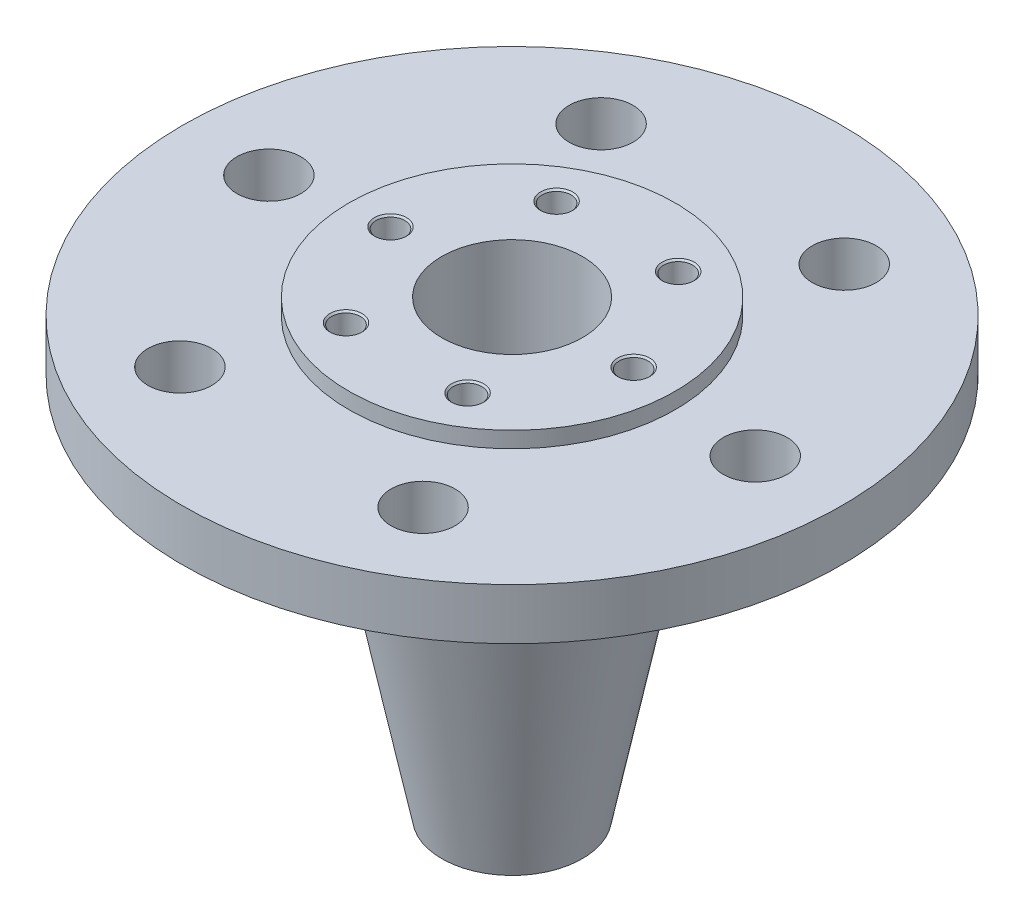
ISO-10303-21;
HEADER;
FILE_DESCRIPTION(('STEP AP214'),'2;1');
FILE_NAME('part.step','',(''),(''),'','','');
FILE_SCHEMA(('AUTOMOTIVE_DESIGN { 1 0 10303 214 1 1 1 1 }'));
ENDSEC;
DATA;
#1=APPLICATION_CONTEXT('core data for automotive mechanical design processes');
#2=APPLICATION_PROTOCOL_DEFINITION('international standard','automotive_design',2000,#1);
#3=PRODUCT_CONTEXT('',#1,'mechanical');
#4=PRODUCT('Part','Part','',(#3));
#5=PRODUCT_RELATED_PRODUCT_CATEGORY('part','',(#4));
#6=PRODUCT_DEFINITION_FORMATION('','',#4);
#7=PRODUCT_DEFINITION_CONTEXT('part definition',#1,'design');
#8=PRODUCT_DEFINITION('design','',#6,#7);
#9=PRODUCT_DEFINITION_SHAPE('','',#8);
#10=(LENGTH_UNIT() NAMED_UNIT(*) SI_UNIT(.MILLI.,.METRE.));
#11=(NAMED_UNIT(*) PLANE_ANGLE_UNIT() SI_UNIT($,.RADIAN.));
#12=(NAMED_UNIT(*) SI_UNIT($,.STERADIAN.) SOLID_ANGLE_UNIT());
#13=UNCERTAINTY_MEASURE_WITH_UNIT(LENGTH_MEASURE(1.E-05),#10,'distance_accuracy_value','');
#14=(GEOMETRIC_REPRESENTATION_CONTEXT(3) GLOBAL_UNCERTAINTY_ASSIGNED_CONTEXT((#13)) GLOBAL_UNIT_ASSIGNED_CONTEXT((#10,
#11,#12)) REPRESENTATION_CONTEXT('',''));
#15=CARTESIAN_POINT('',(0.,0.,0.));
#16=DIRECTION('',(0.,0.,1.));
#17=DIRECTION('',(1.,0.,0.));
#18=AXIS2_PLACEMENT_3D('',#15,#16,#17);
#19=CARTESIAN_POINT('',(103.,136.,0.));
#20=DIRECTION('',(0.,-1.,0.));
#21=DIRECTION('',(1.,0.,0.));
#22=AXIS2_PLACEMENT_3D('',#19,#20,#21);
#23=PLANE('',#22);
#24=CARTESIAN_POINT('',(38.0000000000008,136.,-65.8179306876169));
#25=DIRECTION('',(0.,1.,0.));
#26=DIRECTION('',(0.,0.,1.));
#27=AXIS2_PLACEMENT_3D('',#24,#25,#26);
#28=CIRCLE('',#27,10.);
#29=CARTESIAN_POINT('',(38.0000000000008,136.,-55.8179306876169));
#30=VERTEX_POINT('',#29);
#31=EDGE_CURVE('E156',#30,#30,#28,.T.);
#32=ORIENTED_EDGE('',*,*,#31,.F.);
#33=EDGE_LOOP('',(#32));
#34=FACE_BOUND('',#33,.T.);
#35=CARTESIAN_POINT('',(-37.9999999999994,136.,-65.8179306876177));
#36=DIRECTION('',(0.,1.,0.));
#37=DIRECTION('',(0.,0.,1.));
#38=AXIS2_PLACEMENT_3D('',#35,#36,#37);
#39=CIRCLE('',#38,10.);
#40=CARTESIAN_POINT('',(-37.9999999999994,136.,-55.8179306876177));
#41=VERTEX_POINT('',#40);
#42=EDGE_CURVE('E164',#41,#41,#39,.T.);
#43=ORIENTED_EDGE('',*,*,#42,.F.);
#44=EDGE_LOOP('',(#43));
#45=FACE_BOUND('',#44,.T.);
#46=CARTESIAN_POINT('',(-76.,136.,0.));
#47=DIRECTION('',(0.,1.,0.));
#48=DIRECTION('',(0.,0.,1.));
#49=AXIS2_PLACEMENT_3D('',#46,#47,#48);
#50=CIRCLE('',#49,10.);
#51=CARTESIAN_POINT('',(-76.,136.,10.));
#52=VERTEX_POINT('',#51);
#53=EDGE_CURVE('E172',#52,#52,#50,.T.);
#54=ORIENTED_EDGE('',*,*,#53,.F.);
#55=EDGE_LOOP('',(#54));
#56=FACE_BOUND('',#55,.T.);
#57=CARTESIAN_POINT('',(-38.0000000000003,136.,65.8179306876172));
#58=DIRECTION('',(0.,1.,0.));
#59=DIRECTION('',(0.,0.,1.));
#60=AXIS2_PLACEMENT_3D('',#57,#58,#59);
#61=CIRCLE('',#60,10.);
#62=CARTESIAN_POINT('',(-38.0000000000003,136.,75.8179306876172));
#63=VERTEX_POINT('',#62);
#64=EDGE_CURVE('E180',#63,#63,#61,.T.);
#65=ORIENTED_EDGE('',*,*,#64,.F.);
#66=EDGE_LOOP('',(#65));
#67=FACE_BOUND('',#66,.T.);
#68=CARTESIAN_POINT('',(37.9999999999998,136.,65.8179306876174));
#69=DIRECTION('',(0.,1.,0.));
#70=DIRECTION('',(0.,0.,1.));
#71=AXIS2_PLACEMENT_3D('',#68,#69,#70);
#72=CIRCLE('',#71,10.);
#73=CARTESIAN_POINT('',(37.9999999999998,136.,75.8179306876174));
#74=VERTEX_POINT('',#73);
#75=EDGE_CURVE('E188',#74,#74,#72,.T.);
#76=ORIENTED_EDGE('',*,*,#75,.F.);
#77=EDGE_LOOP('',(#76));
#78=FACE_BOUND('',#77,.T.);
#79=CARTESIAN_POINT('',(0.,136.,0.));
#80=DIRECTION('',(0.,1.,0.));
#81=DIRECTION('',(-1.,0.,0.));
#82=AXIS2_PLACEMENT_3D('',#79,#80,#81);
#83=CIRCLE('',#82,51.);
#84=CARTESIAN_POINT('',(-51.,136.,0.));
#85=VERTEX_POINT('',#84);
#86=EDGE_CURVE('E240',#85,#85,#83,.T.);
#87=ORIENTED_EDGE('',*,*,#86,.F.);
#88=EDGE_LOOP('',(#87));
#89=FACE_BOUND('',#88,.T.);
#90=CARTESIAN_POINT('',(0.,136.,0.));
#91=DIRECTION('',(0.,1.,0.));
#92=DIRECTION('',(-1.,0.,0.));
#93=AXIS2_PLACEMENT_3D('',#90,#91,#92);
#94=CIRCLE('',#93,103.);
#95=CARTESIAN_POINT('',(-103.,136.,0.));
#96=VERTEX_POINT('',#95);
#97=EDGE_CURVE('E244',#96,#96,#94,.T.);
#98=ORIENTED_EDGE('',*,*,#97,.T.);
#99=EDGE_LOOP('',(#98));
#100=FACE_BOUND('',#99,.T.);
#101=CARTESIAN_POINT('',(76.,136.,0.));
#102=DIRECTION('',(0.,1.,0.));
#103=DIRECTION('',(0.,0.,1.));
#104=AXIS2_PLACEMENT_3D('',#101,#102,#103);
#105=CIRCLE('',#104,10.);
#106=CARTESIAN_POINT('',(76.,136.,10.));
#107=VERTEX_POINT('',#106);
#108=EDGE_CURVE('E196',#107,#107,#105,.T.);
#109=ORIENTED_EDGE('',*,*,#108,.F.);
#110=EDGE_LOOP('',(#109));
#111=FACE_BOUND('',#110,.T.);
#112=ADVANCED_FACE('F49',(#34,#45,#56,#67,#78,#89,#100,#111),#23,.F.);
#113=CARTESIAN_POINT('',(0.,0.,0.));
#114=DIRECTION('',(0.,1.,0.));
#115=DIRECTION('',(-1.,0.,0.));
#116=AXIS2_PLACEMENT_3D('',#113,#114,#115);
#117=PLANE('',#116);
#118=CARTESIAN_POINT('',(0.,0.,0.));
#119=DIRECTION('',(0.,1.,0.));
#120=DIRECTION('',(-1.,0.,0.));
#121=AXIS2_PLACEMENT_3D('',#118,#119,#120);
#122=CIRCLE('',#121,11.4143486418335);
#123=CARTESIAN_POINT('',(-11.4143486418335,0.,0.));
#124=VERTEX_POINT('',#123);
#125=EDGE_CURVE('E232',#124,#124,#122,.T.);
#126=ORIENTED_EDGE('',*,*,#125,.T.);
#127=EDGE_LOOP('',(#126));
#128=FACE_BOUND('',#127,.T.);
#129=CARTESIAN_POINT('',(0.,0.,0.));
#130=DIRECTION('',(0.,1.,0.));
#131=DIRECTION('',(-1.,0.,0.));
#132=AXIS2_PLACEMENT_3D('',#129,#130,#131);
#133=CIRCLE('',#132,22.);
#134=CARTESIAN_POINT('',(-22.,0.,0.));
#135=VERTEX_POINT('',#134);
#136=EDGE_CURVE('E11',#135,#135,#133,.T.);
#137=ORIENTED_EDGE('',*,*,#136,.F.);
#138=EDGE_LOOP('',(#137));
#139=FACE_BOUND('',#138,.T.);
#140=ADVANCED_FACE('F51',(#128,#139),#117,.F.);
#141=CARTESIAN_POINT('',(0.,0.,0.));
#142=DIRECTION('',(0.,1.,0.));
#143=DIRECTION('',(-1.,0.,0.));
#144=AXIS2_PLACEMENT_3D('',#141,#142,#143);
#145=CONICAL_SURFACE('',#144,22.,0.197395559849881);
#146=CARTESIAN_POINT('',(0.,110.,0.));
#147=DIRECTION('',(0.,1.,0.));
#148=DIRECTION('',(-1.,0.,0.));
#149=AXIS2_PLACEMENT_3D('',#146,#147,#148);
#150=CIRCLE('',#149,44.);
#151=CARTESIAN_POINT('',(-44.,110.,0.));
#152=VERTEX_POINT('',#151);
#153=EDGE_CURVE('E58',#152,#152,#150,.T.);
#154=ORIENTED_EDGE('',*,*,#153,.F.);
#155=EDGE_LOOP('',(#154));
#156=FACE_BOUND('',#155,.T.);
#157=ORIENTED_EDGE('',*,*,#136,.T.);
#158=EDGE_LOOP('',(#157));
#159=FACE_BOUND('',#158,.T.);
#160=ADVANCED_FACE('F265',(#156,#159),#145,.T.);
#161=CARTESIAN_POINT('',(44.,110.,0.));
#162=DIRECTION('',(0.,1.,0.));
#163=DIRECTION('',(-1.,0.,0.));
#164=AXIS2_PLACEMENT_3D('',#161,#162,#163);
#165=PLANE('',#164);
#166=CARTESIAN_POINT('',(0.,110.,0.));
#167=DIRECTION('',(0.,1.,0.));
#168=DIRECTION('',(-1.,0.,0.));
#169=AXIS2_PLACEMENT_3D('',#166,#167,#168);
#170=CIRCLE('',#169,54.);
#171=CARTESIAN_POINT('',(-54.,110.,0.));
#172=VERTEX_POINT('',#171);
#173=EDGE_CURVE('E256',#172,#172,#170,.T.);
#174=ORIENTED_EDGE('',*,*,#173,.F.);
#175=EDGE_LOOP('',(#174));
#176=FACE_BOUND('',#175,.T.);
#177=ORIENTED_EDGE('',*,*,#153,.T.);
#178=EDGE_LOOP('',(#177));
#179=FACE_BOUND('',#178,.T.);
#180=ADVANCED_FACE('F263',(#176,#179),#165,.F.);
#181=CARTESIAN_POINT('',(0.,141.,0.));
#182=DIRECTION('',(0.,1.,0.));
#183=DIRECTION('',(-1.,0.,0.));
#184=AXIS2_PLACEMENT_3D('',#181,#182,#183);
#185=CYLINDRICAL_SURFACE('',#184,54.);
#186=CARTESIAN_POINT('',(0.,120.,0.));
#187=DIRECTION('',(0.,1.,0.));
#188=DIRECTION('',(-1.,0.,0.));
#189=AXIS2_PLACEMENT_3D('',#186,#187,#188);
#190=CIRCLE('',#189,54.);
#191=CARTESIAN_POINT('',(-54.,120.,0.));
#192=VERTEX_POINT('',#191);
#193=EDGE_CURVE('E252',#192,#192,#190,.T.);
#194=ORIENTED_EDGE('',*,*,#193,.F.);
#195=EDGE_LOOP('',(#194));
#196=FACE_BOUND('',#195,.T.);
#197=ORIENTED_EDGE('',*,*,#173,.T.);
#198=EDGE_LOOP('',(#197));
#199=FACE_BOUND('',#198,.T.);
#200=ADVANCED_FACE('F307',(#196,#199),#185,.T.);
#201=CARTESIAN_POINT('',(54.,120.,0.));
#202=DIRECTION('',(0.,1.,0.));
#203=DIRECTION('',(-1.,0.,0.));
#204=AXIS2_PLACEMENT_3D('',#201,#202,#203);
#205=PLANE('',#204);
#206=CARTESIAN_POINT('',(38.0000000000008,120.,-65.8179306876169));
#207=DIRECTION('',(0.,1.,0.));
#208=DIRECTION('',(0.,0.,1.));
#209=AXIS2_PLACEMENT_3D('',#206,#207,#208);
#210=CIRCLE('',#209,10.);
#211=CARTESIAN_POINT('',(38.0000000000008,120.,-55.8179306876169));
#212=VERTEX_POINT('',#211);
#213=EDGE_CURVE('E160',#212,#212,#210,.T.);
#214=ORIENTED_EDGE('',*,*,#213,.T.);
#215=EDGE_LOOP('',(#214));
#216=FACE_BOUND('',#215,.T.);
#217=CARTESIAN_POINT('',(-37.9999999999994,120.,-65.8179306876177));
#218=DIRECTION('',(0.,1.,0.));
#219=DIRECTION('',(0.,0.,1.));
#220=AXIS2_PLACEMENT_3D('',#217,#218,#219);
#221=CIRCLE('',#220,10.);
#222=CARTESIAN_POINT('',(-37.9999999999994,120.,-55.8179306876177));
#223=VERTEX_POINT('',#222);
#224=EDGE_CURVE('E168',#223,#223,#221,.T.);
#225=ORIENTED_EDGE('',*,*,#224,.T.);
#226=EDGE_LOOP('',(#225));
#227=FACE_BOUND('',#226,.T.);
#228=CARTESIAN_POINT('',(-76.,120.,0.));
#229=DIRECTION('',(0.,1.,0.));
#230=DIRECTION('',(0.,0.,1.));
#231=AXIS2_PLACEMENT_3D('',#228,#229,#230);
#232=CIRCLE('',#231,10.);
#233=CARTESIAN_POINT('',(-76.,120.,10.));
#234=VERTEX_POINT('',#233);
#235=EDGE_CURVE('E176',#234,#234,#232,.T.);
#236=ORIENTED_EDGE('',*,*,#235,.T.);
#237=EDGE_LOOP('',(#236));
#238=FACE_BOUND('',#237,.T.);
#239=CARTESIAN_POINT('',(-38.0000000000003,120.,65.8179306876172));
#240=DIRECTION('',(0.,1.,0.));
#241=DIRECTION('',(0.,0.,1.));
#242=AXIS2_PLACEMENT_3D('',#239,#240,#241);
#243=CIRCLE('',#242,10.);
#244=CARTESIAN_POINT('',(-38.0000000000003,120.,75.8179306876172));
#245=VERTEX_POINT('',#244);
#246=EDGE_CURVE('E184',#245,#245,#243,.T.);
#247=ORIENTED_EDGE('',*,*,#246,.T.);
#248=EDGE_LOOP('',(#247));
#249=FACE_BOUND('',#248,.T.);
#250=CARTESIAN_POINT('',(37.9999999999998,120.,65.8179306876174));
#251=DIRECTION('',(0.,1.,0.));
#252=DIRECTION('',(0.,0.,1.));
#253=AXIS2_PLACEMENT_3D('',#250,#251,#252);
#254=CIRCLE('',#253,10.);
#255=CARTESIAN_POINT('',(37.9999999999998,120.,75.8179306876174));
#256=VERTEX_POINT('',#255);
#257=EDGE_CURVE('E192',#256,#256,#254,.T.);
#258=ORIENTED_EDGE('',*,*,#257,.T.);
#259=EDGE_LOOP('',(#258));
#260=FACE_BOUND('',#259,.T.);
#261=CARTESIAN_POINT('',(76.,120.,0.));
#262=DIRECTION('',(0.,1.,0.));
#263=DIRECTION('',(0.,0.,1.));
#264=AXIS2_PLACEMENT_3D('',#261,#262,#263);
#265=CIRCLE('',#264,10.);
#266=CARTESIAN_POINT('',(76.,120.,10.));
#267=VERTEX_POINT('',#266);
#268=EDGE_CURVE('E200',#267,#267,#265,.T.);
#269=ORIENTED_EDGE('',*,*,#268,.T.);
#270=EDGE_LOOP('',(#269));
#271=FACE_BOUND('',#270,.T.);
#272=CARTESIAN_POINT('',(0.,120.,0.));
#273=DIRECTION('',(0.,1.,0.));
#274=DIRECTION('',(-1.,0.,0.));
#275=AXIS2_PLACEMENT_3D('',#272,#273,#274);
#276=CIRCLE('',#275,103.);
#277=CARTESIAN_POINT('',(-103.,120.,0.));
#278=VERTEX_POINT('',#277);
#279=EDGE_CURVE('E248',#278,#278,#276,.T.);
#280=ORIENTED_EDGE('',*,*,#279,.F.);
#281=EDGE_LOOP('',(#280));
#282=FACE_BOUND('',#281,.T.);
#283=ORIENTED_EDGE('',*,*,#193,.T.);
#284=EDGE_LOOP('',(#283));
#285=FACE_BOUND('',#284,.T.);
#286=ADVANCED_FACE('F303',(#216,#227,#238,#249,#260,#271,#282,#285),#205,.F.);
#287=CARTESIAN_POINT('',(0.,141.,0.));
#288=DIRECTION('',(0.,1.,0.));
#289=DIRECTION('',(-1.,0.,0.));
#290=AXIS2_PLACEMENT_3D('',#287,#288,#289);
#291=CYLINDRICAL_SURFACE('',#290,103.);
#292=ORIENTED_EDGE('',*,*,#97,.F.);
#293=EDGE_LOOP('',(#292));
#294=FACE_BOUND('',#293,.T.);
#295=ORIENTED_EDGE('',*,*,#279,.T.);
#296=EDGE_LOOP('',(#295));
#297=FACE_BOUND('',#296,.T.);
#298=ADVANCED_FACE('F298',(#294,#297),#291,.T.);
#299=CARTESIAN_POINT('',(0.,141.,0.));
#300=DIRECTION('',(0.,1.,0.));
#301=DIRECTION('',(-1.,0.,0.));
#302=AXIS2_PLACEMENT_3D('',#299,#300,#301);
#303=CYLINDRICAL_SURFACE('',#302,51.);
#304=CARTESIAN_POINT('',(0.,141.,0.));
#305=DIRECTION('',(0.,1.,0.));
#306=DIRECTION('',(-1.,0.,0.));
#307=AXIS2_PLACEMENT_3D('',#304,#305,#306);
#308=CIRCLE('',#307,51.);
#309=CARTESIAN_POINT('',(-51.,141.,0.));
#310=VERTEX_POINT('',#309);
#311=EDGE_CURVE('E236',#310,#310,#308,.T.);
#312=ORIENTED_EDGE('',*,*,#311,.F.);
#313=EDGE_LOOP('',(#312));
#314=FACE_BOUND('',#313,.T.);
#315=ORIENTED_EDGE('',*,*,#86,.T.);
#316=EDGE_LOOP('',(#315));
#317=FACE_BOUND('',#316,.T.);
#318=ADVANCED_FACE('F293',(#314,#317),#303,.T.);
#319=CARTESIAN_POINT('',(51.,141.,0.));
#320=DIRECTION('',(0.,-1.,0.));
#321=DIRECTION('',(1.,0.,0.));
#322=AXIS2_PLACEMENT_3D('',#319,#320,#321);
#323=PLANE('',#322);
#324=CARTESIAN_POINT('',(19.0000000000004,141.,-32.9089653438084));
#325=DIRECTION('',(0.,1.,0.));
#326=DIRECTION('',(0.,0.,1.));
#327=AXIS2_PLACEMENT_3D('',#324,#325,#326);
#328=CIRCLE('',#327,5.025);
#329=CARTESIAN_POINT('',(19.0000000000004,141.,-27.8839653438084));
#330=VERTEX_POINT('',#329);
#331=EDGE_CURVE('E97',#330,#330,#328,.T.);
#332=ORIENTED_EDGE('',*,*,#331,.F.);
#333=EDGE_LOOP('',(#332));
#334=FACE_BOUND('',#333,.T.);
#335=CARTESIAN_POINT('',(-18.9999999999997,141.,-32.9089653438088));
#336=DIRECTION('',(0.,1.,0.));
#337=DIRECTION('',(0.,0.,1.));
#338=AXIS2_PLACEMENT_3D('',#335,#336,#337);
#339=CIRCLE('',#338,5.025);
#340=CARTESIAN_POINT('',(-18.9999999999997,141.,-27.8839653438088));
#341=VERTEX_POINT('',#340);
#342=EDGE_CURVE('E88',#341,#341,#339,.T.);
#343=ORIENTED_EDGE('',*,*,#342,.F.);
#344=EDGE_LOOP('',(#343));
#345=FACE_BOUND('',#344,.T.);
#346=CARTESIAN_POINT('',(-38.,141.,0.));
#347=DIRECTION('',(0.,1.,0.));
#348=DIRECTION('',(0.,0.,1.));
#349=AXIS2_PLACEMENT_3D('',#346,#347,#348);
#350=CIRCLE('',#349,5.025);
#351=CARTESIAN_POINT('',(-38.,141.,5.025));
#352=VERTEX_POINT('',#351);
#353=EDGE_CURVE('E108',#352,#352,#350,.T.);
#354=ORIENTED_EDGE('',*,*,#353,.F.);
#355=EDGE_LOOP('',(#354));
#356=FACE_BOUND('',#355,.T.);
#357=CARTESIAN_POINT('',(-19.0000000000002,141.,32.9089653438086));
#358=DIRECTION('',(0.,1.,0.));
#359=DIRECTION('',(0.,0.,1.));
#360=AXIS2_PLACEMENT_3D('',#357,#358,#359);
#361=CIRCLE('',#360,5.025);
#362=CARTESIAN_POINT('',(-19.0000000000002,141.,37.9339653438086));
#363=VERTEX_POINT('',#362);
#364=EDGE_CURVE('E120',#363,#363,#361,.T.);
#365=ORIENTED_EDGE('',*,*,#364,.F.);
#366=EDGE_LOOP('',(#365));
#367=FACE_BOUND('',#366,.T.);
#368=CARTESIAN_POINT('',(18.9999999999999,141.,32.9089653438087));
#369=DIRECTION('',(0.,1.,0.));
#370=DIRECTION('',(0.,0.,1.));
#371=AXIS2_PLACEMENT_3D('',#368,#369,#370);
#372=CIRCLE('',#371,5.025);
#373=CARTESIAN_POINT('',(18.9999999999999,141.,37.9339653438087));
#374=VERTEX_POINT('',#373);
#375=EDGE_CURVE('E132',#374,#374,#372,.T.);
#376=ORIENTED_EDGE('',*,*,#375,.F.);
#377=EDGE_LOOP('',(#376));
#378=FACE_BOUND('',#377,.T.);
#379=CARTESIAN_POINT('',(38.,141.,0.));
#380=DIRECTION('',(0.,1.,0.));
#381=DIRECTION('',(0.,0.,1.));
#382=AXIS2_PLACEMENT_3D('',#379,#380,#381);
#383=CIRCLE('',#382,5.025);
#384=CARTESIAN_POINT('',(38.,141.,5.025));
#385=VERTEX_POINT('',#384);
#386=EDGE_CURVE('E144',#385,#385,#383,.T.);
#387=ORIENTED_EDGE('',*,*,#386,.F.);
#388=EDGE_LOOP('',(#387));
#389=FACE_BOUND('',#388,.T.);
#390=CARTESIAN_POINT('',(0.,141.,0.));
#391=DIRECTION('',(0.,1.,0.));
#392=DIRECTION('',(-1.,0.,0.));
#393=AXIS2_PLACEMENT_3D('',#390,#391,#392);
#394=CIRCLE('',#393,22.);
#395=CARTESIAN_POINT('',(-22.,141.,0.));
#396=VERTEX_POINT('',#395);
#397=EDGE_CURVE('E204',#396,#396,#394,.T.);
#398=ORIENTED_EDGE('',*,*,#397,.F.);
#399=EDGE_LOOP('',(#398));
#400=FACE_BOUND('',#399,.T.);
#401=ORIENTED_EDGE('',*,*,#311,.T.);
#402=EDGE_LOOP('',(#401));
#403=FACE_BOUND('',#402,.T.);
#404=ADVANCED_FACE('F283',(#334,#345,#356,#367,#378,#389,#400,#403),#323,.F.);
#405=CARTESIAN_POINT('',(0.,141.,0.));
#406=DIRECTION('',(0.,1.,0.));
#407=DIRECTION('',(-1.,0.,0.));
#408=AXIS2_PLACEMENT_3D('',#405,#406,#407);
#409=CYLINDRICAL_SURFACE('',#408,11.4143486418335);
#410=CARTESIAN_POINT('',(0.,38.,0.));
#411=DIRECTION('',(0.,1.,0.));
#412=DIRECTION('',(-1.,0.,0.));
#413=AXIS2_PLACEMENT_3D('',#410,#411,#412);
#414=CIRCLE('',#413,11.4143486418335);
#415=CARTESIAN_POINT('',(-11.4143486418335,38.,0.));
#416=VERTEX_POINT('',#415);
#417=EDGE_CURVE('E228',#416,#416,#414,.T.);
#418=ORIENTED_EDGE('',*,*,#417,.T.);
#419=EDGE_LOOP('',(#418));
#420=FACE_BOUND('',#419,.T.);
#421=ORIENTED_EDGE('',*,*,#125,.F.);
#422=EDGE_LOOP('',(#421));
#423=FACE_BOUND('',#422,.T.);
#424=ADVANCED_FACE('F281',(#420,#423),#409,.F.);
#425=CARTESIAN_POINT('',(0.,38.,0.));
#426=DIRECTION('',(0.,1.,0.));
#427=DIRECTION('',(-1.,0.,0.));
#428=AXIS2_PLACEMENT_3D('',#425,#426,#427);
#429=CONICAL_SURFACE('',#428,11.4143486418335,0.785398163397454);
#430=CARTESIAN_POINT('',(0.,42.5856513581665,0.));
#431=DIRECTION('',(0.,1.,0.));
#432=DIRECTION('',(-1.,0.,0.));
#433=AXIS2_PLACEMENT_3D('',#430,#431,#432);
#434=CIRCLE('',#433,16.);
#435=CARTESIAN_POINT('',(-16.,42.5856513581665,0.));
#436=VERTEX_POINT('',#435);
#437=EDGE_CURVE('E224',#436,#436,#434,.T.);
#438=ORIENTED_EDGE('',*,*,#437,.T.);
#439=EDGE_LOOP('',(#438));
#440=FACE_BOUND('',#439,.T.);
#441=ORIENTED_EDGE('',*,*,#417,.F.);
#442=EDGE_LOOP('',(#441));
#443=FACE_BOUND('',#442,.T.);
#444=ADVANCED_FACE('F282',(#440,#443),#429,.F.);
#445=CARTESIAN_POINT('',(0.,141.,0.));
#446=DIRECTION('',(0.,1.,0.));
#447=DIRECTION('',(-1.,0.,0.));
#448=AXIS2_PLACEMENT_3D('',#445,#446,#447);
#449=CYLINDRICAL_SURFACE('',#448,16.);
#450=CARTESIAN_POINT('',(0.,54.7529620340124,0.));
#451=DIRECTION('',(0.,1.,0.));
#452=DIRECTION('',(-1.,0.,0.));
#453=AXIS2_PLACEMENT_3D('',#450,#451,#452);
#454=CIRCLE('',#453,16.);
#455=CARTESIAN_POINT('',(-16.,54.7529620340124,0.));
#456=VERTEX_POINT('',#455);
#457=EDGE_CURVE('E220',#456,#456,#454,.T.);
#458=ORIENTED_EDGE('',*,*,#457,.T.);
#459=EDGE_LOOP('',(#458));
#460=FACE_BOUND('',#459,.T.);
#461=ORIENTED_EDGE('',*,*,#437,.F.);
#462=EDGE_LOOP('',(#461));
#463=FACE_BOUND('',#462,.T.);
#464=ADVANCED_FACE('F289',(#460,#463),#449,.F.);
#465=CARTESIAN_POINT('',(0.,54.7529620340124,0.));
#466=DIRECTION('',(0.,-1.,0.));
#467=DIRECTION('',(1.,0.,0.));
#468=AXIS2_PLACEMENT_3D('',#465,#466,#467);
#469=CONICAL_SURFACE('',#468,16.,0.994837673636769);
#470=CARTESIAN_POINT('',(0.,58.,0.));
#471=DIRECTION('',(0.,1.,0.));
#472=DIRECTION('',(-1.,0.,0.));
#473=AXIS2_PLACEMENT_3D('',#470,#471,#472);
#474=CIRCLE('',#473,11.);
#475=CARTESIAN_POINT('',(-11.,58.,0.));
#476=VERTEX_POINT('',#475);
#477=EDGE_CURVE('E216',#476,#476,#474,.T.);
#478=ORIENTED_EDGE('',*,*,#477,.T.);
#479=EDGE_LOOP('',(#478));
#480=FACE_BOUND('',#479,.T.);
#481=ORIENTED_EDGE('',*,*,#457,.F.);
#482=EDGE_LOOP('',(#481));
#483=FACE_BOUND('',#482,.T.);
#484=ADVANCED_FACE('F366',(#480,#483),#469,.F.);
#485=CARTESIAN_POINT('',(0.,141.,0.));
#486=DIRECTION('',(0.,1.,0.));
#487=DIRECTION('',(-1.,0.,0.));
#488=AXIS2_PLACEMENT_3D('',#485,#486,#487);
#489=CYLINDRICAL_SURFACE('',#488,11.);
#490=CARTESIAN_POINT('',(0.,75.0000000000002,0.));
#491=DIRECTION('',(0.,1.,0.));
#492=DIRECTION('',(-1.,0.,0.));
#493=AXIS2_PLACEMENT_3D('',#490,#491,#492);
#494=CIRCLE('',#493,11.);
#495=CARTESIAN_POINT('',(-11.,75.0000000000002,0.));
#496=VERTEX_POINT('',#495);
#497=EDGE_CURVE('E212',#496,#496,#494,.T.);
#498=ORIENTED_EDGE('',*,*,#497,.T.);
#499=EDGE_LOOP('',(#498));
#500=FACE_BOUND('',#499,.T.);
#501=ORIENTED_EDGE('',*,*,#477,.F.);
#502=EDGE_LOOP('',(#501));
#503=FACE_BOUND('',#502,.T.);
#504=ADVANCED_FACE('F375',(#500,#503),#489,.F.);
#505=CARTESIAN_POINT('',(0.,75.0000000000002,0.));
#506=DIRECTION('',(0.,1.,0.));
#507=DIRECTION('',(-1.,0.,0.));
#508=AXIS2_PLACEMENT_3D('',#505,#506,#507);
#509=CONICAL_SURFACE('',#508,11.,0.785398163397454);
#510=CARTESIAN_POINT('',(0.,86.,0.));
#511=DIRECTION('',(0.,1.,0.));
#512=DIRECTION('',(-1.,0.,0.));
#513=AXIS2_PLACEMENT_3D('',#510,#511,#512);
#514=CIRCLE('',#513,22.);
#515=CARTESIAN_POINT('',(-22.,86.,0.));
#516=VERTEX_POINT('',#515);
#517=EDGE_CURVE('E208',#516,#516,#514,.T.);
#518=ORIENTED_EDGE('',*,*,#517,.T.);
#519=EDGE_LOOP('',(#518));
#520=FACE_BOUND('',#519,.T.);
#521=ORIENTED_EDGE('',*,*,#497,.F.);
#522=EDGE_LOOP('',(#521));
#523=FACE_BOUND('',#522,.T.);
#524=ADVANCED_FACE('F385',(#520,#523),#509,.F.);
#525=CARTESIAN_POINT('',(0.,141.,0.));
#526=DIRECTION('',(0.,1.,0.));
#527=DIRECTION('',(-1.,0.,0.));
#528=AXIS2_PLACEMENT_3D('',#525,#526,#527);
#529=CYLINDRICAL_SURFACE('',#528,22.);
#530=ORIENTED_EDGE('',*,*,#397,.T.);
#531=EDGE_LOOP('',(#530));
#532=FACE_BOUND('',#531,.T.);
#533=ORIENTED_EDGE('',*,*,#517,.F.);
#534=EDGE_LOOP('',(#533));
#535=FACE_BOUND('',#534,.T.);
#536=ADVANCED_FACE('F395',(#532,#535),#529,.F.);
#537=CARTESIAN_POINT('',(76.,136.,0.));
#538=DIRECTION('',(0.,1.,0.));
#539=DIRECTION('',(0.,0.,1.));
#540=AXIS2_PLACEMENT_3D('',#537,#538,#539);
#541=CYLINDRICAL_SURFACE('',#540,10.);
#542=ORIENTED_EDGE('',*,*,#268,.F.);
#543=EDGE_LOOP('',(#542));
#544=FACE_BOUND('',#543,.T.);
#545=ORIENTED_EDGE('',*,*,#108,.T.);
#546=EDGE_LOOP('',(#545));
#547=FACE_BOUND('',#546,.T.);
#548=ADVANCED_FACE('F405',(#544,#547),#541,.F.);
#549=CARTESIAN_POINT('',(37.9999999999998,136.,65.8179306876174));
#550=DIRECTION('',(0.,1.,0.));
#551=DIRECTION('',(0.,0.,1.));
#552=AXIS2_PLACEMENT_3D('',#549,#550,#551);
#553=CYLINDRICAL_SURFACE('',#552,10.);
#554=ORIENTED_EDGE('',*,*,#257,.F.);
#555=EDGE_LOOP('',(#554));
#556=FACE_BOUND('',#555,.T.);
#557=ORIENTED_EDGE('',*,*,#75,.T.);
#558=EDGE_LOOP('',(#557));
#559=FACE_BOUND('',#558,.T.);
#560=ADVANCED_FACE('F420',(#556,#559),#553,.F.);
#561=CARTESIAN_POINT('',(-38.0000000000003,136.,65.8179306876172));
#562=DIRECTION('',(0.,1.,0.));
#563=DIRECTION('',(0.,0.,1.));
#564=AXIS2_PLACEMENT_3D('',#561,#562,#563);
#565=CYLINDRICAL_SURFACE('',#564,10.);
#566=ORIENTED_EDGE('',*,*,#246,.F.);
#567=EDGE_LOOP('',(#566));
#568=FACE_BOUND('',#567,.T.);
#569=ORIENTED_EDGE('',*,*,#64,.T.);
#570=EDGE_LOOP('',(#569));
#571=FACE_BOUND('',#570,.T.);
#572=ADVANCED_FACE('F430',(#568,#571),#565,.F.);
#573=CARTESIAN_POINT('',(-76.,136.,0.));
#574=DIRECTION('',(0.,1.,0.));
#575=DIRECTION('',(0.,0.,1.));
#576=AXIS2_PLACEMENT_3D('',#573,#574,#575);
#577=CYLINDRICAL_SURFACE('',#576,10.);
#578=ORIENTED_EDGE('',*,*,#235,.F.);
#579=EDGE_LOOP('',(#578));
#580=FACE_BOUND('',#579,.T.);
#581=ORIENTED_EDGE('',*,*,#53,.T.);
#582=EDGE_LOOP('',(#581));
#583=FACE_BOUND('',#582,.T.);
#584=ADVANCED_FACE('F440',(#580,#583),#577,.F.);
#585=CARTESIAN_POINT('',(-37.9999999999994,136.,-65.8179306876177));
#586=DIRECTION('',(0.,1.,0.));
#587=DIRECTION('',(0.,0.,1.));
#588=AXIS2_PLACEMENT_3D('',#585,#586,#587);
#589=CYLINDRICAL_SURFACE('',#588,10.);
#590=ORIENTED_EDGE('',*,*,#224,.F.);
#591=EDGE_LOOP('',(#590));
#592=FACE_BOUND('',#591,.T.);
#593=ORIENTED_EDGE('',*,*,#42,.T.);
#594=EDGE_LOOP('',(#593));
#595=FACE_BOUND('',#594,.T.);
#596=ADVANCED_FACE('F450',(#592,#595),#589,.F.);
#597=CARTESIAN_POINT('',(38.0000000000008,136.,-65.8179306876169));
#598=DIRECTION('',(0.,1.,0.));
#599=DIRECTION('',(0.,0.,1.));
#600=AXIS2_PLACEMENT_3D('',#597,#598,#599);
#601=CYLINDRICAL_SURFACE('',#600,10.);
#602=ORIENTED_EDGE('',*,*,#213,.F.);
#603=EDGE_LOOP('',(#602));
#604=FACE_BOUND('',#603,.T.);
#605=ORIENTED_EDGE('',*,*,#31,.T.);
#606=EDGE_LOOP('',(#605));
#607=FACE_BOUND('',#606,.T.);
#608=ADVANCED_FACE('F460',(#604,#607),#601,.F.);
#609=CARTESIAN_POINT('',(38.,126.,0.));
#610=DIRECTION('',(0.,1.,0.));
#611=DIRECTION('',(0.,0.,1.));
#612=AXIS2_PLACEMENT_3D('',#609,#610,#611);
#613=CONICAL_SURFACE('',#612,4.5,1.02974425867665);
#614=CARTESIAN_POINT('',(38.,123.296127214376,0.));
#615=VERTEX_POINT('',#614);
#616=VERTEX_LOOP('',#615);
#617=FACE_BOUND('',#616,.T.);
#618=CARTESIAN_POINT('',(38.,126.,0.));
#619=DIRECTION('',(0.,1.,0.));
#620=DIRECTION('',(0.,0.,1.));
#621=AXIS2_PLACEMENT_3D('',#618,#619,#620);
#622=CIRCLE('',#621,4.5);
#623=CARTESIAN_POINT('',(38.,126.,4.5));
#624=VERTEX_POINT('',#623);
#625=EDGE_CURVE('E152',#624,#624,#622,.T.);
#626=ORIENTED_EDGE('',*,*,#625,.T.);
#627=EDGE_LOOP('',(#626));
#628=FACE_BOUND('',#627,.T.);
#629=ADVANCED_FACE('F470',(#617,#628),#613,.F.);
#630=CARTESIAN_POINT('',(38.,141.,0.));
#631=DIRECTION('',(0.,1.,0.));
#632=DIRECTION('',(0.,0.,1.));
#633=AXIS2_PLACEMENT_3D('',#630,#631,#632);
#634=CYLINDRICAL_SURFACE('',#633,4.5);
#635=ORIENTED_EDGE('',*,*,#625,.F.);
#636=EDGE_LOOP('',(#635));
#637=FACE_BOUND('',#636,.T.);
#638=CARTESIAN_POINT('',(38.,140.475,0.));
#639=DIRECTION('',(0.,1.,0.));
#640=DIRECTION('',(0.,0.,1.));
#641=AXIS2_PLACEMENT_3D('',#638,#639,#640);
#642=CIRCLE('',#641,4.5);
#643=CARTESIAN_POINT('',(38.,140.475,4.5));
#644=VERTEX_POINT('',#643);
#645=EDGE_CURVE('E148',#644,#644,#642,.T.);
#646=ORIENTED_EDGE('',*,*,#645,.T.);
#647=EDGE_LOOP('',(#646));
#648=FACE_BOUND('',#647,.T.);
#649=ADVANCED_FACE('F480',(#637,#648),#634,.F.);
#650=CARTESIAN_POINT('',(38.,141.,0.));
#651=DIRECTION('',(0.,1.,0.));
#652=DIRECTION('',(0.,0.,1.));
#653=AXIS2_PLACEMENT_3D('',#650,#651,#652);
#654=CONICAL_SURFACE('',#653,5.025,0.785398163397455);
#655=ORIENTED_EDGE('',*,*,#645,.F.);
#656=EDGE_LOOP('',(#655));
#657=FACE_BOUND('',#656,.T.);
#658=ORIENTED_EDGE('',*,*,#386,.T.);
#659=EDGE_LOOP('',(#658));
#660=FACE_BOUND('',#659,.T.);
#661=ADVANCED_FACE('F490',(#657,#660),#654,.F.);
#662=CARTESIAN_POINT('',(18.9999999999999,126.,32.9089653438087));
#663=DIRECTION('',(0.,1.,0.));
#664=DIRECTION('',(0.,0.,1.));
#665=AXIS2_PLACEMENT_3D('',#662,#663,#664);
#666=CONICAL_SURFACE('',#665,4.5,1.02974425867665);
#667=CARTESIAN_POINT('',(18.9999999999999,123.296127214376,32.9089653438087));
#668=VERTEX_POINT('',#667);
#669=VERTEX_LOOP('',#668);
#670=FACE_BOUND('',#669,.T.);
#671=CARTESIAN_POINT('',(18.9999999999999,126.,32.9089653438087));
#672=DIRECTION('',(0.,1.,0.));
#673=DIRECTION('',(0.,0.,1.));
#674=AXIS2_PLACEMENT_3D('',#671,#672,#673);
#675=CIRCLE('',#674,4.5);
#676=CARTESIAN_POINT('',(18.9999999999999,126.,37.4089653438087));
#677=VERTEX_POINT('',#676);
#678=EDGE_CURVE('E140',#677,#677,#675,.T.);
#679=ORIENTED_EDGE('',*,*,#678,.T.);
#680=EDGE_LOOP('',(#679));
#681=FACE_BOUND('',#680,.T.);
#682=ADVANCED_FACE('F501',(#670,#681),#666,.F.);
#683=CARTESIAN_POINT('',(18.9999999999999,141.,32.9089653438087));
#684=DIRECTION('',(0.,1.,0.));
#685=DIRECTION('',(0.,0.,1.));
#686=AXIS2_PLACEMENT_3D('',#683,#684,#685);
#687=CYLINDRICAL_SURFACE('',#686,4.5);
#688=ORIENTED_EDGE('',*,*,#678,.F.);
#689=EDGE_LOOP('',(#688));
#690=FACE_BOUND('',#689,.T.);
#691=CARTESIAN_POINT('',(18.9999999999999,140.475,32.9089653438087));
#692=DIRECTION('',(0.,1.,0.));
#693=DIRECTION('',(0.,0.,1.));
#694=AXIS2_PLACEMENT_3D('',#691,#692,#693);
#695=CIRCLE('',#694,4.5);
#696=CARTESIAN_POINT('',(18.9999999999999,140.475,37.4089653438087));
#697=VERTEX_POINT('',#696);
#698=EDGE_CURVE('E136',#697,#697,#695,.T.);
#699=ORIENTED_EDGE('',*,*,#698,.T.);
#700=EDGE_LOOP('',(#699));
#701=FACE_BOUND('',#700,.T.);
#702=ADVANCED_FACE('F511',(#690,#701),#687,.F.);
#703=CARTESIAN_POINT('',(18.9999999999999,141.,32.9089653438087));
#704=DIRECTION('',(0.,1.,0.));
#705=DIRECTION('',(0.,0.,1.));
#706=AXIS2_PLACEMENT_3D('',#703,#704,#705);
#707=CONICAL_SURFACE('',#706,5.025,0.785398163397455);
#708=ORIENTED_EDGE('',*,*,#698,.F.);
#709=EDGE_LOOP('',(#708));
#710=FACE_BOUND('',#709,.T.);
#711=ORIENTED_EDGE('',*,*,#375,.T.);
#712=EDGE_LOOP('',(#711));
#713=FACE_BOUND('',#712,.T.);
#714=ADVANCED_FACE('F521',(#710,#713),#707,.F.);
#715=CARTESIAN_POINT('',(-19.0000000000002,126.,32.9089653438086));
#716=DIRECTION('',(0.,1.,0.));
#717=DIRECTION('',(0.,0.,1.));
#718=AXIS2_PLACEMENT_3D('',#715,#716,#717);
#719=CONICAL_SURFACE('',#718,4.5,1.02974425867665);
#720=CARTESIAN_POINT('',(-19.0000000000002,123.296127214376,32.9089653438086));
#721=VERTEX_POINT('',#720);
#722=VERTEX_LOOP('',#721);
#723=FACE_BOUND('',#722,.T.);
#724=CARTESIAN_POINT('',(-19.0000000000002,126.,32.9089653438086));
#725=DIRECTION('',(0.,1.,0.));
#726=DIRECTION('',(0.,0.,1.));
#727=AXIS2_PLACEMENT_3D('',#724,#725,#726);
#728=CIRCLE('',#727,4.5);
#729=CARTESIAN_POINT('',(-19.0000000000002,126.,37.4089653438086));
#730=VERTEX_POINT('',#729);
#731=EDGE_CURVE('E128',#730,#730,#728,.T.);
#732=ORIENTED_EDGE('',*,*,#731,.T.);
#733=EDGE_LOOP('',(#732));
#734=FACE_BOUND('',#733,.T.);
#735=ADVANCED_FACE('F533',(#723,#734),#719,.F.);
#736=CARTESIAN_POINT('',(-19.0000000000002,141.,32.9089653438086));
#737=DIRECTION('',(0.,1.,0.));
#738=DIRECTION('',(0.,0.,1.));
#739=AXIS2_PLACEMENT_3D('',#736,#737,#738);
#740=CYLINDRICAL_SURFACE('',#739,4.5);
#741=ORIENTED_EDGE('',*,*,#731,.F.);
#742=EDGE_LOOP('',(#741));
#743=FACE_BOUND('',#742,.T.);
#744=CARTESIAN_POINT('',(-19.0000000000002,140.475,32.9089653438086));
#745=DIRECTION('',(0.,1.,0.));
#746=DIRECTION('',(0.,0.,1.));
#747=AXIS2_PLACEMENT_3D('',#744,#745,#746);
#748=CIRCLE('',#747,4.5);
#749=CARTESIAN_POINT('',(-19.0000000000002,140.475,37.4089653438086));
#750=VERTEX_POINT('',#749);
#751=EDGE_CURVE('E124',#750,#750,#748,.T.);
#752=ORIENTED_EDGE('',*,*,#751,.T.);
#753=EDGE_LOOP('',(#752));
#754=FACE_BOUND('',#753,.T.);
#755=ADVANCED_FACE('F543',(#743,#754),#740,.F.);
#756=CARTESIAN_POINT('',(-19.0000000000002,141.,32.9089653438086));
#757=DIRECTION('',(0.,1.,0.));
#758=DIRECTION('',(0.,0.,1.));
#759=AXIS2_PLACEMENT_3D('',#756,#757,#758);
#760=CONICAL_SURFACE('',#759,5.025,0.785398163397455);
#761=ORIENTED_EDGE('',*,*,#751,.F.);
#762=EDGE_LOOP('',(#761));
#763=FACE_BOUND('',#762,.T.);
#764=ORIENTED_EDGE('',*,*,#364,.T.);
#765=EDGE_LOOP('',(#764));
#766=FACE_BOUND('',#765,.T.);
#767=ADVANCED_FACE('F554',(#763,#766),#760,.F.);
#768=CARTESIAN_POINT('',(-38.,126.,0.));
#769=DIRECTION('',(0.,1.,0.));
#770=DIRECTION('',(0.,0.,1.));
#771=AXIS2_PLACEMENT_3D('',#768,#769,#770);
#772=CONICAL_SURFACE('',#771,4.5,1.02974425867665);
#773=CARTESIAN_POINT('',(-38.,123.296127214376,0.));
#774=VERTEX_POINT('',#773);
#775=VERTEX_LOOP('',#774);
#776=FACE_BOUND('',#775,.T.);
#777=CARTESIAN_POINT('',(-38.,126.,0.));
#778=DIRECTION('',(0.,1.,0.));
#779=DIRECTION('',(0.,0.,1.));
#780=AXIS2_PLACEMENT_3D('',#777,#778,#779);
#781=CIRCLE('',#780,4.5);
#782=CARTESIAN_POINT('',(-38.,126.,4.5));
#783=VERTEX_POINT('',#782);
#784=EDGE_CURVE('E116',#783,#783,#781,.T.);
#785=ORIENTED_EDGE('',*,*,#784,.T.);
#786=EDGE_LOOP('',(#785));
#787=FACE_BOUND('',#786,.T.);
#788=ADVANCED_FACE('F566',(#776,#787),#772,.F.);
#789=CARTESIAN_POINT('',(-38.,141.,0.));
#790=DIRECTION('',(0.,1.,0.));
#791=DIRECTION('',(0.,0.,1.));
#792=AXIS2_PLACEMENT_3D('',#789,#790,#791);
#793=CYLINDRICAL_SURFACE('',#792,4.5);
#794=ORIENTED_EDGE('',*,*,#784,.F.);
#795=EDGE_LOOP('',(#794));
#796=FACE_BOUND('',#795,.T.);
#797=CARTESIAN_POINT('',(-38.,140.475,0.));
#798=DIRECTION('',(0.,1.,0.));
#799=DIRECTION('',(0.,0.,1.));
#800=AXIS2_PLACEMENT_3D('',#797,#798,#799);
#801=CIRCLE('',#800,4.5);
#802=CARTESIAN_POINT('',(-38.,140.475,4.5));
#803=VERTEX_POINT('',#802);
#804=EDGE_CURVE('E112',#803,#803,#801,.T.);
#805=ORIENTED_EDGE('',*,*,#804,.T.);
#806=EDGE_LOOP('',(#805));
#807=FACE_BOUND('',#806,.T.);
#808=ADVANCED_FACE('F576',(#796,#807),#793,.F.);
#809=CARTESIAN_POINT('',(-38.,141.,0.));
#810=DIRECTION('',(0.,1.,0.));
#811=DIRECTION('',(0.,0.,1.));
#812=AXIS2_PLACEMENT_3D('',#809,#810,#811);
#813=CONICAL_SURFACE('',#812,5.025,0.785398163397455);
#814=ORIENTED_EDGE('',*,*,#804,.F.);
#815=EDGE_LOOP('',(#814));
#816=FACE_BOUND('',#815,.T.);
#817=ORIENTED_EDGE('',*,*,#353,.T.);
#818=EDGE_LOOP('',(#817));
#819=FACE_BOUND('',#818,.T.);
#820=ADVANCED_FACE('F587',(#816,#819),#813,.F.);
#821=CARTESIAN_POINT('',(-18.9999999999997,126.,-32.9089653438088));
#822=DIRECTION('',(0.,1.,0.));
#823=DIRECTION('',(0.,0.,1.));
#824=AXIS2_PLACEMENT_3D('',#821,#822,#823);
#825=CONICAL_SURFACE('',#824,4.5,1.02974425867665);
#826=CARTESIAN_POINT('',(-18.9999999999997,123.296127214376,-32.9089653438088));
#827=VERTEX_POINT('',#826);
#828=VERTEX_LOOP('',#827);
#829=FACE_BOUND('',#828,.T.);
#830=CARTESIAN_POINT('',(-18.9999999999997,126.,-32.9089653438088));
#831=DIRECTION('',(0.,1.,0.));
#832=DIRECTION('',(0.,0.,1.));
#833=AXIS2_PLACEMENT_3D('',#830,#831,#832);
#834=CIRCLE('',#833,4.5);
#835=CARTESIAN_POINT('',(-18.9999999999997,126.,-28.4089653438089));
#836=VERTEX_POINT('',#835);
#837=EDGE_CURVE('E104',#836,#836,#834,.T.);
#838=ORIENTED_EDGE('',*,*,#837,.T.);
#839=EDGE_LOOP('',(#838));
#840=FACE_BOUND('',#839,.T.);
#841=ADVANCED_FACE('F599',(#829,#840),#825,.F.);
#842=CARTESIAN_POINT('',(-18.9999999999997,141.,-32.9089653438088));
#843=DIRECTION('',(0.,1.,0.));
#844=DIRECTION('',(0.,0.,1.));
#845=AXIS2_PLACEMENT_3D('',#842,#843,#844);
#846=CYLINDRICAL_SURFACE('',#845,4.5);
#847=ORIENTED_EDGE('',*,*,#837,.F.);
#848=EDGE_LOOP('',(#847));
#849=FACE_BOUND('',#848,.T.);
#850=CARTESIAN_POINT('',(-18.9999999999997,140.475,-32.9089653438088));
#851=DIRECTION('',(0.,1.,0.));
#852=DIRECTION('',(0.,0.,1.));
#853=AXIS2_PLACEMENT_3D('',#850,#851,#852);
#854=CIRCLE('',#853,4.5);
#855=CARTESIAN_POINT('',(-18.9999999999997,140.475,-28.4089653438089));
#856=VERTEX_POINT('',#855);
#857=EDGE_CURVE('E94',#856,#856,#854,.T.);
#858=ORIENTED_EDGE('',*,*,#857,.T.);
#859=EDGE_LOOP('',(#858));
#860=FACE_BOUND('',#859,.T.);
#861=ADVANCED_FACE('F609',(#849,#860),#846,.F.);
#862=CARTESIAN_POINT('',(-18.9999999999997,141.,-32.9089653438088));
#863=DIRECTION('',(0.,1.,0.));
#864=DIRECTION('',(0.,0.,1.));
#865=AXIS2_PLACEMENT_3D('',#862,#863,#864);
#866=CONICAL_SURFACE('',#865,5.025,0.785398163397455);
#867=ORIENTED_EDGE('',*,*,#857,.F.);
#868=EDGE_LOOP('',(#867));
#869=FACE_BOUND('',#868,.T.);
#870=ORIENTED_EDGE('',*,*,#342,.T.);
#871=EDGE_LOOP('',(#870));
#872=FACE_BOUND('',#871,.T.);
#873=ADVANCED_FACE('F81',(#869,#872),#866,.F.);
#874=CARTESIAN_POINT('',(19.0000000000004,126.,-32.9089653438084));
#875=DIRECTION('',(0.,1.,0.));
#876=DIRECTION('',(0.,0.,1.));
#877=AXIS2_PLACEMENT_3D('',#874,#875,#876);
#878=CONICAL_SURFACE('',#877,4.5,1.02974425867665);
#879=CARTESIAN_POINT('',(19.0000000000004,123.296127214376,-32.9089653438084));
#880=VERTEX_POINT('',#879);
#881=VERTEX_LOOP('',#880);
#882=FACE_BOUND('',#881,.T.);
#883=CARTESIAN_POINT('',(19.0000000000004,126.,-32.9089653438084));
#884=DIRECTION('',(0.,1.,0.));
#885=DIRECTION('',(0.,0.,1.));
#886=AXIS2_PLACEMENT_3D('',#883,#884,#885);
#887=CIRCLE('',#886,4.5);
#888=CARTESIAN_POINT('',(19.0000000000004,126.,-28.4089653438084));
#889=VERTEX_POINT('',#888);
#890=EDGE_CURVE('E85',#889,#889,#887,.T.);
#891=ORIENTED_EDGE('',*,*,#890,.T.);
#892=EDGE_LOOP('',(#891));
#893=FACE_BOUND('',#892,.T.);
#894=ADVANCED_FACE('F77',(#882,#893),#878,.F.);
#895=CARTESIAN_POINT('',(19.0000000000004,141.,-32.9089653438084));
#896=DIRECTION('',(0.,1.,0.));
#897=DIRECTION('',(0.,0.,1.));
#898=AXIS2_PLACEMENT_3D('',#895,#896,#897);
#899=CYLINDRICAL_SURFACE('',#898,4.5);
#900=ORIENTED_EDGE('',*,*,#890,.F.);
#901=EDGE_LOOP('',(#900));
#902=FACE_BOUND('',#901,.T.);
#903=CARTESIAN_POINT('',(19.0000000000004,140.475,-32.9089653438084));
#904=DIRECTION('',(0.,1.,0.));
#905=DIRECTION('',(0.,0.,1.));
#906=AXIS2_PLACEMENT_3D('',#903,#904,#905);
#907=CIRCLE('',#906,4.5);
#908=CARTESIAN_POINT('',(19.0000000000004,140.475,-28.4089653438084));
#909=VERTEX_POINT('',#908);
#910=EDGE_CURVE('E89',#909,#909,#907,.T.);
#911=ORIENTED_EDGE('',*,*,#910,.T.);
#912=EDGE_LOOP('',(#911));
#913=FACE_BOUND('',#912,.T.);
#914=ADVANCED_FACE('F80',(#902,#913),#899,.F.);
#915=CARTESIAN_POINT('',(19.0000000000004,141.,-32.9089653438084));
#916=DIRECTION('',(0.,1.,0.));
#917=DIRECTION('',(0.,0.,1.));
#918=AXIS2_PLACEMENT_3D('',#915,#916,#917);
#919=CONICAL_SURFACE('',#918,5.025,0.785398163397455);
#920=ORIENTED_EDGE('',*,*,#910,.F.);
#921=EDGE_LOOP('',(#920));
#922=FACE_BOUND('',#921,.T.);
#923=ORIENTED_EDGE('',*,*,#331,.T.);
#924=EDGE_LOOP('',(#923));
#925=FACE_BOUND('',#924,.T.);
#926=ADVANCED_FACE('F647',(#922,#925),#919,.F.);
#927=CLOSED_SHELL('',(#112,#140,#160,#180,#200,#286,#298,#318,#404,#424,#444,#464,#484,#504,
#524,#536,#548,#560,#572,#584,#596,#608,#629,#649,#661,#682,#702,#714,#735,#755,#767,#788,#808,
#820,#841,#861,#873,#894,#914,#926));
#928=MANIFOLD_SOLID_BREP('B2',#927);
#929=ADVANCED_BREP_SHAPE_REPRESENTATION('',(#18,#928),#14);
#930=SHAPE_DEFINITION_REPRESENTATION(#9,#929);
ENDSEC;
END-ISO-10303-21;
